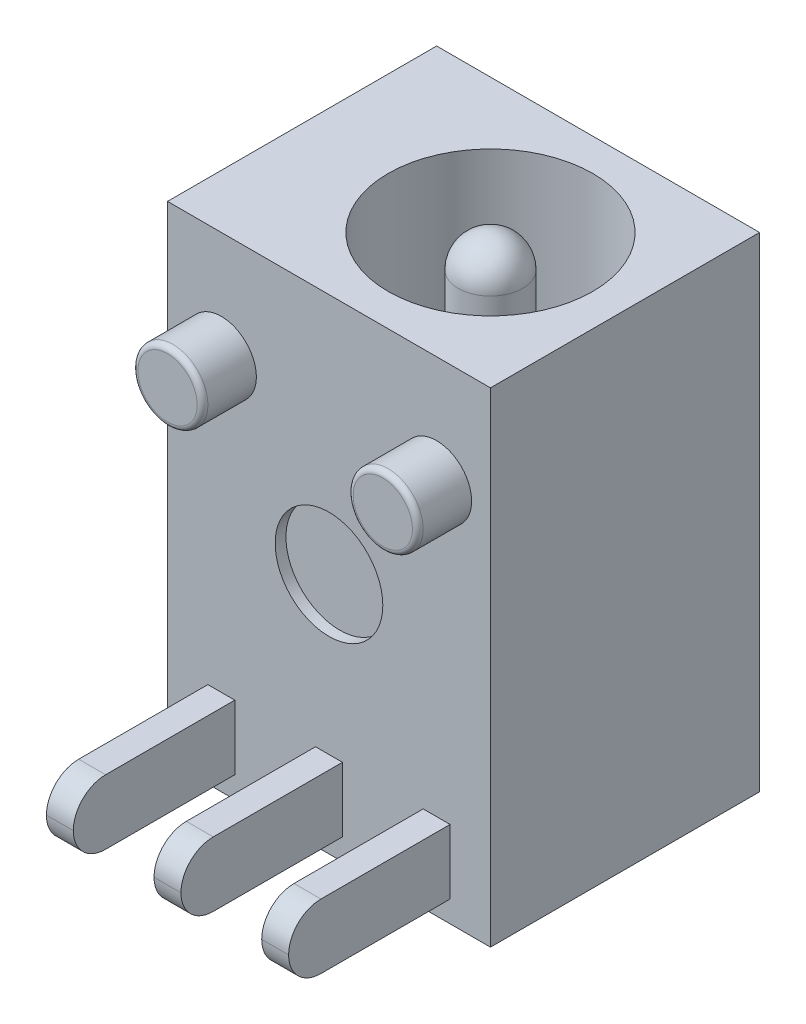
ISO-10303-21;
HEADER;
FILE_DESCRIPTION(('STEP AP214'),'2;1');
FILE_NAME('part.step','',(''),(''),'','','');
FILE_SCHEMA(('AUTOMOTIVE_DESIGN { 1 0 10303 214 1 1 1 1 }'));
ENDSEC;
DATA;
#1=APPLICATION_CONTEXT('core data for automotive mechanical design processes');
#2=APPLICATION_PROTOCOL_DEFINITION('international standard','automotive_design',2000,#1);
#3=PRODUCT_CONTEXT('',#1,'mechanical');
#4=PRODUCT('Part','Part','',(#3));
#5=PRODUCT_RELATED_PRODUCT_CATEGORY('part','',(#4));
#6=PRODUCT_DEFINITION_FORMATION('','',#4);
#7=PRODUCT_DEFINITION_CONTEXT('part definition',#1,'design');
#8=PRODUCT_DEFINITION('design','',#6,#7);
#9=PRODUCT_DEFINITION_SHAPE('','',#8);
#10=(LENGTH_UNIT() NAMED_UNIT(*) SI_UNIT(.MILLI.,.METRE.));
#11=(NAMED_UNIT(*) PLANE_ANGLE_UNIT() SI_UNIT($,.RADIAN.));
#12=(NAMED_UNIT(*) SI_UNIT($,.STERADIAN.) SOLID_ANGLE_UNIT());
#13=UNCERTAINTY_MEASURE_WITH_UNIT(LENGTH_MEASURE(1.E-05),#10,'distance_accuracy_value','');
#14=(GEOMETRIC_REPRESENTATION_CONTEXT(3) GLOBAL_UNCERTAINTY_ASSIGNED_CONTEXT((#13)) GLOBAL_UNIT_ASSIGNED_CONTEXT((#10,
#11,#12)) REPRESENTATION_CONTEXT('',''));
#15=CARTESIAN_POINT('',(0.,0.,0.));
#16=DIRECTION('',(0.,0.,1.));
#17=DIRECTION('',(1.,0.,0.));
#18=AXIS2_PLACEMENT_3D('',#15,#16,#17);
#19=CARTESIAN_POINT('',(-3.,9.,2.5));
#20=DIRECTION('',(0.,0.,-1.));
#21=DIRECTION('',(-1.,0.,0.));
#22=AXIS2_PLACEMENT_3D('',#19,#20,#21);
#23=PLANE('',#22);
#24=CARTESIAN_POINT('',(0.,4.5,2.5));
#25=DIRECTION('',(0.,0.,1.));
#26=DIRECTION('',(1.,0.,0.));
#27=AXIS2_PLACEMENT_3D('',#24,#25,#26);
#28=CIRCLE('',#27,1.);
#29=CARTESIAN_POINT('',(1.,4.5,2.5));
#30=VERTEX_POINT('',#29);
#31=EDGE_CURVE('E698',#30,#30,#28,.T.);
#32=ORIENTED_EDGE('',*,*,#31,.F.);
#33=EDGE_LOOP('',(#32));
#34=FACE_BOUND('',#33,.T.);
#35=CARTESIAN_POINT('',(-2.,7.,2.5));
#36=DIRECTION('',(0.,0.,-1.));
#37=DIRECTION('',(-1.,0.,0.));
#38=AXIS2_PLACEMENT_3D('',#35,#36,#37);
#39=CIRCLE('',#38,0.65);
#40=CARTESIAN_POINT('',(-2.65,7.,2.5));
#41=VERTEX_POINT('',#40);
#42=EDGE_CURVE('E327',#41,#41,#39,.F.);
#43=ORIENTED_EDGE('',*,*,#42,.F.);
#44=EDGE_LOOP('',(#43));
#45=FACE_BOUND('',#44,.T.);
#46=CARTESIAN_POINT('',(2.,7.,2.5));
#47=DIRECTION('',(0.,0.,-1.));
#48=DIRECTION('',(-1.,0.,0.));
#49=AXIS2_PLACEMENT_3D('',#46,#47,#48);
#50=CIRCLE('',#49,0.65);
#51=CARTESIAN_POINT('',(1.35,7.,2.5));
#52=VERTEX_POINT('',#51);
#53=EDGE_CURVE('E315',#52,#52,#50,.F.);
#54=ORIENTED_EDGE('',*,*,#53,.F.);
#55=EDGE_LOOP('',(#54));
#56=FACE_BOUND('',#55,.T.);
#57=DIRECTION('',(0.,-1.,0.));
#58=VECTOR('',#57,1.);
#59=CARTESIAN_POINT('',(-0.249999999999997,0.399999999999998,2.5));
#60=LINE('',#59,#58);
#61=CARTESIAN_POINT('',(-0.249999999999997,1.6,2.5));
#62=VERTEX_POINT('',#61);
#63=CARTESIAN_POINT('',(-0.249999999999997,0.399999999999999,2.5));
#64=VERTEX_POINT('',#63);
#65=EDGE_CURVE('E197',#62,#64,#60,.T.);
#66=ORIENTED_EDGE('',*,*,#65,.F.);
#67=DIRECTION('',(-1.,0.,0.));
#68=VECTOR('',#67,1.);
#69=CARTESIAN_POINT('',(0.250000000000003,1.6,2.5));
#70=LINE('',#69,#68);
#71=CARTESIAN_POINT('',(0.250000000000002,1.6,2.5));
#72=VERTEX_POINT('',#71);
#73=EDGE_CURVE('E206',#72,#62,#70,.T.);
#74=ORIENTED_EDGE('',*,*,#73,.F.);
#75=DIRECTION('',(0.,1.,0.));
#76=VECTOR('',#75,1.);
#77=CARTESIAN_POINT('',(0.250000000000003,0.399999999999998,2.5));
#78=LINE('',#77,#76);
#79=CARTESIAN_POINT('',(0.250000000000002,0.399999999999998,2.5));
#80=VERTEX_POINT('',#79);
#81=EDGE_CURVE('E203',#80,#72,#78,.T.);
#82=ORIENTED_EDGE('',*,*,#81,.F.);
#83=DIRECTION('',(1.,0.,0.));
#84=VECTOR('',#83,1.);
#85=CARTESIAN_POINT('',(0.250000000000003,0.399999999999998,2.5));
#86=LINE('',#85,#84);
#87=EDGE_CURVE('E200',#64,#80,#86,.T.);
#88=ORIENTED_EDGE('',*,*,#87,.F.);
#89=EDGE_LOOP('',(#66,#74,#82,#88));
#90=FACE_BOUND('',#89,.T.);
#91=DIRECTION('',(1.,0.,0.));
#92=VECTOR('',#91,1.);
#93=CARTESIAN_POINT('',(-3.,0.,2.5));
#94=LINE('',#93,#92);
#95=CARTESIAN_POINT('',(-3.,0.,2.5));
#96=VERTEX_POINT('',#95);
#97=CARTESIAN_POINT('',(3.,0.,2.5));
#98=VERTEX_POINT('',#97);
#99=EDGE_CURVE('E251',#96,#98,#94,.T.);
#100=ORIENTED_EDGE('',*,*,#99,.T.);
#101=DIRECTION('',(0.,-1.,0.));
#102=VECTOR('',#101,1.);
#103=CARTESIAN_POINT('',(3.,9.,2.5));
#104=LINE('',#103,#102);
#105=CARTESIAN_POINT('',(3.,9.,2.5));
#106=VERTEX_POINT('',#105);
#107=EDGE_CURVE('E257',#106,#98,#104,.T.);
#108=ORIENTED_EDGE('',*,*,#107,.F.);
#109=DIRECTION('',(1.,0.,0.));
#110=VECTOR('',#109,1.);
#111=CARTESIAN_POINT('',(-3.,9.,2.5));
#112=LINE('',#111,#110);
#113=CARTESIAN_POINT('',(-3.,9.,2.5));
#114=VERTEX_POINT('',#113);
#115=EDGE_CURVE('E255',#114,#106,#112,.T.);
#116=ORIENTED_EDGE('',*,*,#115,.F.);
#117=DIRECTION('',(0.,-1.,0.));
#118=VECTOR('',#117,1.);
#119=CARTESIAN_POINT('',(-3.,9.,2.5));
#120=LINE('',#119,#118);
#121=EDGE_CURVE('E267',#114,#96,#120,.T.);
#122=ORIENTED_EDGE('',*,*,#121,.T.);
#123=EDGE_LOOP('',(#100,#108,#116,#122));
#124=FACE_BOUND('',#123,.T.);
#125=DIRECTION('',(0.,-1.,0.));
#126=VECTOR('',#125,1.);
#127=CARTESIAN_POINT('',(1.75,1.6,2.5));
#128=LINE('',#127,#126);
#129=CARTESIAN_POINT('',(1.75,1.6,2.5));
#130=VERTEX_POINT('',#129);
#131=CARTESIAN_POINT('',(1.75,0.399999999999999,2.5));
#132=VERTEX_POINT('',#131);
#133=EDGE_CURVE('E217',#130,#132,#128,.T.);
#134=ORIENTED_EDGE('',*,*,#133,.F.);
#135=DIRECTION('',(-1.,0.,0.));
#136=VECTOR('',#135,1.);
#137=CARTESIAN_POINT('',(2.25,1.6,2.5));
#138=LINE('',#137,#136);
#139=CARTESIAN_POINT('',(2.25,1.6,2.5));
#140=VERTEX_POINT('',#139);
#141=EDGE_CURVE('E226',#140,#130,#138,.T.);
#142=ORIENTED_EDGE('',*,*,#141,.F.);
#143=DIRECTION('',(0.,1.,0.));
#144=VECTOR('',#143,1.);
#145=CARTESIAN_POINT('',(2.25,1.6,2.5));
#146=LINE('',#145,#144);
#147=CARTESIAN_POINT('',(2.25,0.399999999999999,2.5));
#148=VERTEX_POINT('',#147);
#149=EDGE_CURVE('E223',#148,#140,#146,.T.);
#150=ORIENTED_EDGE('',*,*,#149,.F.);
#151=DIRECTION('',(1.,0.,0.));
#152=VECTOR('',#151,1.);
#153=CARTESIAN_POINT('',(2.25,0.399999999999999,2.5));
#154=LINE('',#153,#152);
#155=EDGE_CURVE('E220',#132,#148,#154,.T.);
#156=ORIENTED_EDGE('',*,*,#155,.F.);
#157=EDGE_LOOP('',(#134,#142,#150,#156));
#158=FACE_BOUND('',#157,.T.);
#159=DIRECTION('',(0.,-1.,0.));
#160=VECTOR('',#159,1.);
#161=CARTESIAN_POINT('',(-2.25,0.399999999999998,2.5));
#162=LINE('',#161,#160);
#163=CARTESIAN_POINT('',(-2.25,1.6,2.5));
#164=VERTEX_POINT('',#163);
#165=CARTESIAN_POINT('',(-2.25,0.399999999999998,2.5));
#166=VERTEX_POINT('',#165);
#167=EDGE_CURVE('E167',#164,#166,#162,.T.);
#168=ORIENTED_EDGE('',*,*,#167,.F.);
#169=DIRECTION('',(-1.,0.,0.));
#170=VECTOR('',#169,1.);
#171=CARTESIAN_POINT('',(-1.75,1.6,2.5));
#172=LINE('',#171,#170);
#173=CARTESIAN_POINT('',(-1.75,1.6,2.5));
#174=VERTEX_POINT('',#173);
#175=EDGE_CURVE('E174',#174,#164,#172,.T.);
#176=ORIENTED_EDGE('',*,*,#175,.F.);
#177=DIRECTION('',(0.,1.,0.));
#178=VECTOR('',#177,1.);
#179=CARTESIAN_POINT('',(-1.75,0.399999999999998,2.5));
#180=LINE('',#179,#178);
#181=CARTESIAN_POINT('',(-1.75,0.399999999999998,2.5));
#182=VERTEX_POINT('',#181);
#183=EDGE_CURVE('E187',#182,#174,#180,.T.);
#184=ORIENTED_EDGE('',*,*,#183,.F.);
#185=DIRECTION('',(1.,0.,0.));
#186=VECTOR('',#185,1.);
#187=CARTESIAN_POINT('',(-1.75,0.399999999999998,2.5));
#188=LINE('',#187,#186);
#189=EDGE_CURVE('E182',#166,#182,#188,.T.);
#190=ORIENTED_EDGE('',*,*,#189,.F.);
#191=EDGE_LOOP('',(#168,#176,#184,#190));
#192=FACE_BOUND('',#191,.T.);
#193=ADVANCED_FACE('F34',(#34,#45,#56,#90,#124,#158,#192),#23,.F.);
#194=CARTESIAN_POINT('',(3.,9.,2.5));
#195=DIRECTION('',(-1.,0.,0.));
#196=DIRECTION('',(0.,0.,1.));
#197=AXIS2_PLACEMENT_3D('',#194,#195,#196);
#198=PLANE('',#197);
#199=DIRECTION('',(0.,0.,-1.));
#200=VECTOR('',#199,1.);
#201=CARTESIAN_POINT('',(3.,0.,2.5));
#202=LINE('',#201,#200);
#203=CARTESIAN_POINT('',(3.,0.,-2.5));
#204=VERTEX_POINT('',#203);
#205=EDGE_CURVE('E244',#98,#204,#202,.T.);
#206=ORIENTED_EDGE('',*,*,#205,.T.);
#207=DIRECTION('',(0.,-1.,0.));
#208=VECTOR('',#207,1.);
#209=CARTESIAN_POINT('',(3.,9.,-2.5));
#210=LINE('',#209,#208);
#211=CARTESIAN_POINT('',(3.,9.,-2.5));
#212=VERTEX_POINT('',#211);
#213=EDGE_CURVE('E273',#212,#204,#210,.T.);
#214=ORIENTED_EDGE('',*,*,#213,.F.);
#215=DIRECTION('',(0.,0.,-1.));
#216=VECTOR('',#215,1.);
#217=CARTESIAN_POINT('',(3.,9.,2.5));
#218=LINE('',#217,#216);
#219=EDGE_CURVE('E247',#106,#212,#218,.T.);
#220=ORIENTED_EDGE('',*,*,#219,.F.);
#221=ORIENTED_EDGE('',*,*,#107,.T.);
#222=EDGE_LOOP('',(#206,#214,#220,#221));
#223=FACE_BOUND('',#222,.T.);
#224=ADVANCED_FACE('F355',(#223),#198,.F.);
#225=CARTESIAN_POINT('',(-3.,9.,-2.5));
#226=DIRECTION('',(0.,0.,1.));
#227=DIRECTION('',(1.,0.,0.));
#228=AXIS2_PLACEMENT_3D('',#225,#226,#227);
#229=PLANE('',#228);
#230=DIRECTION('',(-1.,0.,0.));
#231=VECTOR('',#230,1.);
#232=CARTESIAN_POINT('',(-3.,0.,-2.5));
#233=LINE('',#232,#231);
#234=CARTESIAN_POINT('',(-3.,0.,-2.5));
#235=VERTEX_POINT('',#234);
#236=EDGE_CURVE('E260',#204,#235,#233,.T.);
#237=ORIENTED_EDGE('',*,*,#236,.T.);
#238=DIRECTION('',(0.,-1.,0.));
#239=VECTOR('',#238,1.);
#240=CARTESIAN_POINT('',(-3.,9.,-2.5));
#241=LINE('',#240,#239);
#242=CARTESIAN_POINT('',(-3.,9.,-2.5));
#243=VERTEX_POINT('',#242);
#244=EDGE_CURVE('E270',#243,#235,#241,.T.);
#245=ORIENTED_EDGE('',*,*,#244,.F.);
#246=DIRECTION('',(-1.,0.,0.));
#247=VECTOR('',#246,1.);
#248=CARTESIAN_POINT('',(-3.,9.,-2.5));
#249=LINE('',#248,#247);
#250=EDGE_CURVE('E250',#212,#243,#249,.T.);
#251=ORIENTED_EDGE('',*,*,#250,.F.);
#252=ORIENTED_EDGE('',*,*,#213,.T.);
#253=EDGE_LOOP('',(#237,#245,#251,#252));
#254=FACE_BOUND('',#253,.T.);
#255=ADVANCED_FACE('F361',(#254),#229,.F.);
#256=CARTESIAN_POINT('',(-3.,9.,2.5));
#257=DIRECTION('',(1.,0.,0.));
#258=DIRECTION('',(0.,0.,-1.));
#259=AXIS2_PLACEMENT_3D('',#256,#257,#258);
#260=PLANE('',#259);
#261=DIRECTION('',(0.,0.,1.));
#262=VECTOR('',#261,1.);
#263=CARTESIAN_POINT('',(-3.,0.,2.5));
#264=LINE('',#263,#262);
#265=EDGE_CURVE('E262',#235,#96,#264,.T.);
#266=ORIENTED_EDGE('',*,*,#265,.T.);
#267=ORIENTED_EDGE('',*,*,#121,.F.);
#268=DIRECTION('',(0.,0.,1.));
#269=VECTOR('',#268,1.);
#270=CARTESIAN_POINT('',(-3.,9.,2.5));
#271=LINE('',#270,#269);
#272=EDGE_CURVE('E253',#243,#114,#271,.T.);
#273=ORIENTED_EDGE('',*,*,#272,.F.);
#274=ORIENTED_EDGE('',*,*,#244,.T.);
#275=EDGE_LOOP('',(#266,#267,#273,#274));
#276=FACE_BOUND('',#275,.T.);
#277=ADVANCED_FACE('F370',(#276),#260,.F.);
#278=CARTESIAN_POINT('',(0.,9.,0.));
#279=DIRECTION('',(0.,-1.,0.));
#280=DIRECTION('',(0.,0.,-1.));
#281=AXIS2_PLACEMENT_3D('',#278,#279,#280);
#282=PLANE('',#281);
#283=CARTESIAN_POINT('',(0.500000000000001,9.,0.));
#284=DIRECTION('',(0.,1.,0.));
#285=DIRECTION('',(0.,0.,1.));
#286=AXIS2_PLACEMENT_3D('',#283,#284,#285);
#287=CIRCLE('',#286,1.9);
#288=CARTESIAN_POINT('',(0.500000000000001,9.,1.9));
#289=VERTEX_POINT('',#288);
#290=EDGE_CURVE('E240',#289,#289,#287,.T.);
#291=ORIENTED_EDGE('',*,*,#290,.F.);
#292=EDGE_LOOP('',(#291));
#293=FACE_BOUND('',#292,.T.);
#294=ORIENTED_EDGE('',*,*,#219,.T.);
#295=ORIENTED_EDGE('',*,*,#250,.T.);
#296=ORIENTED_EDGE('',*,*,#272,.T.);
#297=ORIENTED_EDGE('',*,*,#115,.T.);
#298=EDGE_LOOP('',(#294,#295,#296,#297));
#299=FACE_BOUND('',#298,.T.);
#300=ADVANCED_FACE('F373',(#293,#299),#282,.F.);
#301=CARTESIAN_POINT('',(0.,0.,0.));
#302=DIRECTION('',(0.,-1.,0.));
#303=DIRECTION('',(0.,0.,-1.));
#304=AXIS2_PLACEMENT_3D('',#301,#302,#303);
#305=PLANE('',#304);
#306=ORIENTED_EDGE('',*,*,#205,.F.);
#307=ORIENTED_EDGE('',*,*,#99,.F.);
#308=ORIENTED_EDGE('',*,*,#265,.F.);
#309=ORIENTED_EDGE('',*,*,#236,.F.);
#310=EDGE_LOOP('',(#306,#307,#308,#309));
#311=FACE_BOUND('',#310,.T.);
#312=ADVANCED_FACE('F368',(#311),#305,.T.);
#313=CARTESIAN_POINT('',(0.500000000000001,2.,0.));
#314=DIRECTION('',(0.,1.,0.));
#315=DIRECTION('',(0.,0.,1.));
#316=AXIS2_PLACEMENT_3D('',#313,#314,#315);
#317=CYLINDRICAL_SURFACE('',#316,1.9);
#318=CARTESIAN_POINT('',(0.500000000000001,2.,0.));
#319=DIRECTION('',(0.,1.,0.));
#320=DIRECTION('',(0.,0.,1.));
#321=AXIS2_PLACEMENT_3D('',#318,#319,#320);
#322=CIRCLE('',#321,1.9);
#323=CARTESIAN_POINT('',(0.500000000000001,2.,1.9));
#324=VERTEX_POINT('',#323);
#325=EDGE_CURVE('E241',#324,#324,#322,.T.);
#326=ORIENTED_EDGE('',*,*,#325,.F.);
#327=EDGE_LOOP('',(#326));
#328=FACE_BOUND('',#327,.T.);
#329=ORIENTED_EDGE('',*,*,#290,.T.);
#330=EDGE_LOOP('',(#329));
#331=FACE_BOUND('',#330,.T.);
#332=ADVANCED_FACE('F441',(#328,#331),#317,.F.);
#333=CARTESIAN_POINT('',(0.500000000000001,2.,0.));
#334=DIRECTION('',(0.,1.,0.));
#335=DIRECTION('',(0.,0.,1.));
#336=AXIS2_PLACEMENT_3D('',#333,#334,#335);
#337=PLANE('',#336);
#338=CARTESIAN_POINT('',(0.500000000000001,2.,0.));
#339=DIRECTION('',(0.,1.,0.));
#340=DIRECTION('',(0.,0.,1.));
#341=AXIS2_PLACEMENT_3D('',#338,#339,#340);
#342=CIRCLE('',#341,0.6);
#343=CARTESIAN_POINT('',(0.500000000000001,2.,0.6));
#344=VERTEX_POINT('',#343);
#345=EDGE_CURVE('E237',#344,#344,#342,.T.);
#346=ORIENTED_EDGE('',*,*,#345,.F.);
#347=EDGE_LOOP('',(#346));
#348=FACE_BOUND('',#347,.T.);
#349=ORIENTED_EDGE('',*,*,#325,.T.);
#350=EDGE_LOOP('',(#349));
#351=FACE_BOUND('',#350,.T.);
#352=ADVANCED_FACE('F437',(#348,#351),#337,.T.);
#353=CARTESIAN_POINT('',(0.500000000000001,2.,0.));
#354=DIRECTION('',(0.,1.,0.));
#355=DIRECTION('',(0.,0.,1.));
#356=AXIS2_PLACEMENT_3D('',#353,#354,#355);
#357=CYLINDRICAL_SURFACE('',#356,0.6);
#358=CARTESIAN_POINT('',(0.500000000000001,8.4,0.));
#359=DIRECTION('',(0.,1.,0.));
#360=DIRECTION('',(0.,0.,1.));
#361=AXIS2_PLACEMENT_3D('',#358,#359,#360);
#362=CIRCLE('',#361,0.6);
#363=CARTESIAN_POINT('',(0.500000000000001,8.4,0.6));
#364=VERTEX_POINT('',#363);
#365=EDGE_CURVE('E276',#364,#364,#362,.F.);
#366=ORIENTED_EDGE('',*,*,#365,.T.);
#367=EDGE_LOOP('',(#366));
#368=FACE_BOUND('',#367,.T.);
#369=ORIENTED_EDGE('',*,*,#345,.T.);
#370=EDGE_LOOP('',(#369));
#371=FACE_BOUND('',#370,.T.);
#372=ADVANCED_FACE('F382',(#368,#371),#357,.T.);
#373=CARTESIAN_POINT('',(0.500000000000001,8.4,0.));
#374=DIRECTION('',(0.,-1.,0.));
#375=DIRECTION('',(0.,0.,-1.));
#376=AXIS2_PLACEMENT_3D('',#373,#374,#375);
#377=SPHERICAL_SURFACE('',#376,0.6);
#378=ORIENTED_EDGE('',*,*,#365,.F.);
#379=EDGE_LOOP('',(#378));
#380=FACE_BOUND('',#379,.T.);
#381=ADVANCED_FACE('F378',(#380),#377,.T.);
#382=CARTESIAN_POINT('',(1.75,1.6,5.5));
#383=DIRECTION('',(1.,0.,0.));
#384=DIRECTION('',(0.,0.,-1.));
#385=AXIS2_PLACEMENT_3D('',#382,#383,#384);
#386=PLANE('',#385);
#387=DIRECTION('',(0.,0.,-1.));
#388=VECTOR('',#387,1.);
#389=CARTESIAN_POINT('',(1.75,0.399999999999999,5.5));
#390=LINE('',#389,#388);
#391=CARTESIAN_POINT('',(1.75,0.399999999999999,4.9));
#392=VERTEX_POINT('',#391);
#393=EDGE_CURVE('E235',#392,#132,#390,.T.);
#394=ORIENTED_EDGE('',*,*,#393,.F.);
#395=CARTESIAN_POINT('',(1.75,0.999999999999999,4.9));
#396=DIRECTION('',(1.,0.,0.));
#397=DIRECTION('',(0.,0.,-1.));
#398=AXIS2_PLACEMENT_3D('',#395,#396,#397);
#399=CIRCLE('',#398,0.6);
#400=CARTESIAN_POINT('',(1.75,1.,5.5));
#401=VERTEX_POINT('',#400);
#402=EDGE_CURVE('E54',#392,#401,#399,.F.);
#403=ORIENTED_EDGE('',*,*,#402,.T.);
#404=CARTESIAN_POINT('',(1.75,1.,4.9));
#405=DIRECTION('',(1.,0.,0.));
#406=DIRECTION('',(0.,0.,-1.));
#407=AXIS2_PLACEMENT_3D('',#404,#405,#406);
#408=CIRCLE('',#407,0.6);
#409=CARTESIAN_POINT('',(1.75,1.6,4.9));
#410=VERTEX_POINT('',#409);
#411=EDGE_CURVE('E49',#401,#410,#408,.F.);
#412=ORIENTED_EDGE('',*,*,#411,.T.);
#413=DIRECTION('',(0.,0.,-1.));
#414=VECTOR('',#413,1.);
#415=CARTESIAN_POINT('',(1.75,1.6,5.5));
#416=LINE('',#415,#414);
#417=EDGE_CURVE('E229',#410,#130,#416,.T.);
#418=ORIENTED_EDGE('',*,*,#417,.T.);
#419=ORIENTED_EDGE('',*,*,#133,.T.);
#420=EDGE_LOOP('',(#394,#403,#412,#418,#419));
#421=FACE_BOUND('',#420,.T.);
#422=ADVANCED_FACE('F381',(#421),#386,.F.);
#423=CARTESIAN_POINT('',(2.25,0.399999999999999,5.5));
#424=DIRECTION('',(0.,1.,0.));
#425=DIRECTION('',(0.,0.,1.));
#426=AXIS2_PLACEMENT_3D('',#423,#424,#425);
#427=PLANE('',#426);
#428=DIRECTION('',(0.,0.,-1.));
#429=VECTOR('',#428,1.);
#430=CARTESIAN_POINT('',(2.25,0.399999999999999,5.5));
#431=LINE('',#430,#429);
#432=CARTESIAN_POINT('',(2.25,0.399999999999999,4.9));
#433=VERTEX_POINT('',#432);
#434=EDGE_CURVE('E233',#433,#148,#431,.T.);
#435=ORIENTED_EDGE('',*,*,#434,.F.);
#436=DIRECTION('',(1.,0.,0.));
#437=VECTOR('',#436,1.);
#438=CARTESIAN_POINT('',(2.25,0.399999999999999,4.9));
#439=LINE('',#438,#437);
#440=EDGE_CURVE('E308',#433,#392,#439,.F.);
#441=ORIENTED_EDGE('',*,*,#440,.T.);
#442=ORIENTED_EDGE('',*,*,#393,.T.);
#443=ORIENTED_EDGE('',*,*,#155,.T.);
#444=EDGE_LOOP('',(#435,#441,#442,#443));
#445=FACE_BOUND('',#444,.T.);
#446=ADVANCED_FACE('F425',(#445),#427,.F.);
#447=CARTESIAN_POINT('',(2.25,1.6,5.5));
#448=DIRECTION('',(-1.,0.,0.));
#449=DIRECTION('',(0.,-1.,0.));
#450=AXIS2_PLACEMENT_3D('',#447,#448,#449);
#451=PLANE('',#450);
#452=CARTESIAN_POINT('',(2.25,1.,4.9));
#453=DIRECTION('',(-1.,0.,0.));
#454=DIRECTION('',(0.,-1.,0.));
#455=AXIS2_PLACEMENT_3D('',#452,#453,#454);
#456=CIRCLE('',#455,0.6);
#457=CARTESIAN_POINT('',(2.25,1.6,4.9));
#458=VERTEX_POINT('',#457);
#459=CARTESIAN_POINT('',(2.25,1.,5.5));
#460=VERTEX_POINT('',#459);
#461=EDGE_CURVE('E304',#458,#460,#456,.F.);
#462=ORIENTED_EDGE('',*,*,#461,.T.);
#463=CARTESIAN_POINT('',(2.25,0.999999999999999,4.9));
#464=DIRECTION('',(-1.,0.,0.));
#465=DIRECTION('',(0.,-1.,0.));
#466=AXIS2_PLACEMENT_3D('',#463,#464,#465);
#467=CIRCLE('',#466,0.6);
#468=EDGE_CURVE('E306',#460,#433,#467,.F.);
#469=ORIENTED_EDGE('',*,*,#468,.T.);
#470=ORIENTED_EDGE('',*,*,#434,.T.);
#471=ORIENTED_EDGE('',*,*,#149,.T.);
#472=DIRECTION('',(0.,0.,-1.));
#473=VECTOR('',#472,1.);
#474=CARTESIAN_POINT('',(2.25,1.6,5.5));
#475=LINE('',#474,#473);
#476=EDGE_CURVE('E231',#458,#140,#475,.T.);
#477=ORIENTED_EDGE('',*,*,#476,.F.);
#478=EDGE_LOOP('',(#462,#469,#470,#471,#477));
#479=FACE_BOUND('',#478,.T.);
#480=ADVANCED_FACE('F418',(#479),#451,.F.);
#481=CARTESIAN_POINT('',(2.25,1.6,5.5));
#482=DIRECTION('',(0.,-1.,0.));
#483=DIRECTION('',(0.,0.,-1.));
#484=AXIS2_PLACEMENT_3D('',#481,#482,#483);
#485=PLANE('',#484);
#486=ORIENTED_EDGE('',*,*,#417,.F.);
#487=DIRECTION('',(-1.,0.,0.));
#488=VECTOR('',#487,1.);
#489=CARTESIAN_POINT('',(2.25,1.6,4.9));
#490=LINE('',#489,#488);
#491=EDGE_CURVE('E313',#410,#458,#490,.F.);
#492=ORIENTED_EDGE('',*,*,#491,.T.);
#493=ORIENTED_EDGE('',*,*,#476,.T.);
#494=ORIENTED_EDGE('',*,*,#141,.T.);
#495=EDGE_LOOP('',(#486,#492,#493,#494));
#496=FACE_BOUND('',#495,.T.);
#497=ADVANCED_FACE('F415',(#496),#485,.F.);
#498=CARTESIAN_POINT('',(-0.249999999999997,0.399999999999998,5.5));
#499=DIRECTION('',(1.,0.,0.));
#500=DIRECTION('',(0.,0.,-1.));
#501=AXIS2_PLACEMENT_3D('',#498,#499,#500);
#502=PLANE('',#501);
#503=CARTESIAN_POINT('',(-0.249999999999997,0.999999999999998,4.9));
#504=DIRECTION('',(1.,0.,0.));
#505=DIRECTION('',(0.,0.,-1.));
#506=AXIS2_PLACEMENT_3D('',#503,#504,#505);
#507=CIRCLE('',#506,0.6);
#508=CARTESIAN_POINT('',(-0.249999999999997,0.399999999999998,4.9));
#509=VERTEX_POINT('',#508);
#510=CARTESIAN_POINT('',(-0.249999999999997,0.999999999999998,5.5));
#511=VERTEX_POINT('',#510);
#512=EDGE_CURVE('E291',#509,#511,#507,.F.);
#513=ORIENTED_EDGE('',*,*,#512,.T.);
#514=CARTESIAN_POINT('',(-0.249999999999997,0.999999999999999,4.9));
#515=DIRECTION('',(1.,0.,0.));
#516=DIRECTION('',(0.,0.,-1.));
#517=AXIS2_PLACEMENT_3D('',#514,#515,#516);
#518=CIRCLE('',#517,0.6);
#519=CARTESIAN_POINT('',(-0.249999999999997,1.6,4.9));
#520=VERTEX_POINT('',#519);
#521=EDGE_CURVE('E293',#511,#520,#518,.F.);
#522=ORIENTED_EDGE('',*,*,#521,.T.);
#523=DIRECTION('',(0.,0.,-1.));
#524=VECTOR('',#523,1.);
#525=CARTESIAN_POINT('',(-0.249999999999997,1.6,5.5));
#526=LINE('',#525,#524);
#527=EDGE_CURVE('E209',#520,#62,#526,.T.);
#528=ORIENTED_EDGE('',*,*,#527,.T.);
#529=ORIENTED_EDGE('',*,*,#65,.T.);
#530=DIRECTION('',(0.,0.,-1.));
#531=VECTOR('',#530,1.);
#532=CARTESIAN_POINT('',(-0.249999999999997,0.399999999999998,5.5));
#533=LINE('',#532,#531);
#534=EDGE_CURVE('E215',#509,#64,#533,.T.);
#535=ORIENTED_EDGE('',*,*,#534,.F.);
#536=EDGE_LOOP('',(#513,#522,#528,#529,#535));
#537=FACE_BOUND('',#536,.T.);
#538=ADVANCED_FACE('F511',(#537),#502,.F.);
#539=CARTESIAN_POINT('',(0.250000000000003,0.399999999999998,5.5));
#540=DIRECTION('',(0.,1.,0.));
#541=DIRECTION('',(0.,0.,1.));
#542=AXIS2_PLACEMENT_3D('',#539,#540,#541);
#543=PLANE('',#542);
#544=DIRECTION('',(0.,0.,-1.));
#545=VECTOR('',#544,1.);
#546=CARTESIAN_POINT('',(0.250000000000003,0.399999999999998,5.5));
#547=LINE('',#546,#545);
#548=CARTESIAN_POINT('',(0.250000000000003,0.399999999999998,4.9));
#549=VERTEX_POINT('',#548);
#550=EDGE_CURVE('E213',#549,#80,#547,.T.);
#551=ORIENTED_EDGE('',*,*,#550,.F.);
#552=DIRECTION('',(1.,0.,0.));
#553=VECTOR('',#552,1.);
#554=CARTESIAN_POINT('',(-0.249999999999997,0.399999999999998,4.9));
#555=LINE('',#554,#553);
#556=EDGE_CURVE('E302',#549,#509,#555,.F.);
#557=ORIENTED_EDGE('',*,*,#556,.T.);
#558=ORIENTED_EDGE('',*,*,#534,.T.);
#559=ORIENTED_EDGE('',*,*,#87,.T.);
#560=EDGE_LOOP('',(#551,#557,#558,#559));
#561=FACE_BOUND('',#560,.T.);
#562=ADVANCED_FACE('F520',(#561),#543,.F.);
#563=CARTESIAN_POINT('',(0.250000000000003,0.399999999999998,5.5));
#564=DIRECTION('',(-1.,0.,0.));
#565=DIRECTION('',(0.,0.,1.));
#566=AXIS2_PLACEMENT_3D('',#563,#564,#565);
#567=PLANE('',#566);
#568=DIRECTION('',(0.,0.,-1.));
#569=VECTOR('',#568,1.);
#570=CARTESIAN_POINT('',(0.250000000000003,1.6,5.5));
#571=LINE('',#570,#569);
#572=CARTESIAN_POINT('',(0.250000000000003,1.6,4.9));
#573=VERTEX_POINT('',#572);
#574=EDGE_CURVE('E211',#573,#72,#571,.T.);
#575=ORIENTED_EDGE('',*,*,#574,.F.);
#576=CARTESIAN_POINT('',(0.250000000000003,0.999999999999999,4.9));
#577=DIRECTION('',(-1.,0.,0.));
#578=DIRECTION('',(0.,0.,1.));
#579=AXIS2_PLACEMENT_3D('',#576,#577,#578);
#580=CIRCLE('',#579,0.6);
#581=CARTESIAN_POINT('',(0.250000000000003,0.999999999999998,5.5));
#582=VERTEX_POINT('',#581);
#583=EDGE_CURVE('E300',#573,#582,#580,.F.);
#584=ORIENTED_EDGE('',*,*,#583,.T.);
#585=CARTESIAN_POINT('',(0.250000000000003,0.999999999999998,4.9));
#586=DIRECTION('',(-1.,0.,0.));
#587=DIRECTION('',(0.,0.,1.));
#588=AXIS2_PLACEMENT_3D('',#585,#586,#587);
#589=CIRCLE('',#588,0.6);
#590=EDGE_CURVE('E298',#582,#549,#589,.F.);
#591=ORIENTED_EDGE('',*,*,#590,.T.);
#592=ORIENTED_EDGE('',*,*,#550,.T.);
#593=ORIENTED_EDGE('',*,*,#81,.T.);
#594=EDGE_LOOP('',(#575,#584,#591,#592,#593));
#595=FACE_BOUND('',#594,.T.);
#596=ADVANCED_FACE('F530',(#595),#567,.F.);
#597=CARTESIAN_POINT('',(0.250000000000003,1.6,5.5));
#598=DIRECTION('',(0.,-1.,0.));
#599=DIRECTION('',(0.,0.,-1.));
#600=AXIS2_PLACEMENT_3D('',#597,#598,#599);
#601=PLANE('',#600);
#602=ORIENTED_EDGE('',*,*,#527,.F.);
#603=DIRECTION('',(-1.,0.,0.));
#604=VECTOR('',#603,1.);
#605=CARTESIAN_POINT('',(0.250000000000003,1.6,4.9));
#606=LINE('',#605,#604);
#607=EDGE_CURVE('E295',#520,#573,#606,.F.);
#608=ORIENTED_EDGE('',*,*,#607,.T.);
#609=ORIENTED_EDGE('',*,*,#574,.T.);
#610=ORIENTED_EDGE('',*,*,#73,.T.);
#611=EDGE_LOOP('',(#602,#608,#609,#610));
#612=FACE_BOUND('',#611,.T.);
#613=ADVANCED_FACE('F540',(#612),#601,.F.);
#614=CARTESIAN_POINT('',(-2.25,0.399999999999998,5.5));
#615=DIRECTION('',(1.,0.,0.));
#616=DIRECTION('',(0.,0.,-1.));
#617=AXIS2_PLACEMENT_3D('',#614,#615,#616);
#618=PLANE('',#617);
#619=DIRECTION('',(0.,0.,-1.));
#620=VECTOR('',#619,1.);
#621=CARTESIAN_POINT('',(-2.25,0.399999999999998,5.5));
#622=LINE('',#621,#620);
#623=CARTESIAN_POINT('',(-2.25,0.399999999999998,4.9));
#624=VERTEX_POINT('',#623);
#625=EDGE_CURVE('E195',#624,#166,#622,.T.);
#626=ORIENTED_EDGE('',*,*,#625,.F.);
#627=CARTESIAN_POINT('',(-2.25,0.999999999999998,4.9));
#628=DIRECTION('',(1.,0.,0.));
#629=DIRECTION('',(0.,0.,-1.));
#630=AXIS2_PLACEMENT_3D('',#627,#628,#629);
#631=CIRCLE('',#630,0.6);
#632=CARTESIAN_POINT('',(-2.25,0.999999999999998,5.5));
#633=VERTEX_POINT('',#632);
#634=EDGE_CURVE('E287',#624,#633,#631,.F.);
#635=ORIENTED_EDGE('',*,*,#634,.T.);
#636=CARTESIAN_POINT('',(-2.25,0.999999999999998,4.9));
#637=DIRECTION('',(1.,0.,0.));
#638=DIRECTION('',(0.,0.,-1.));
#639=AXIS2_PLACEMENT_3D('',#636,#637,#638);
#640=CIRCLE('',#639,0.6);
#641=CARTESIAN_POINT('',(-2.25,1.6,4.9));
#642=VERTEX_POINT('',#641);
#643=EDGE_CURVE('E169',#633,#642,#640,.F.);
#644=ORIENTED_EDGE('',*,*,#643,.T.);
#645=DIRECTION('',(0.,0.,-1.));
#646=VECTOR('',#645,1.);
#647=CARTESIAN_POINT('',(-2.25,1.6,5.5));
#648=LINE('',#647,#646);
#649=EDGE_CURVE('E163',#642,#164,#648,.T.);
#650=ORIENTED_EDGE('',*,*,#649,.T.);
#651=ORIENTED_EDGE('',*,*,#167,.T.);
#652=EDGE_LOOP('',(#626,#635,#644,#650,#651));
#653=FACE_BOUND('',#652,.T.);
#654=ADVANCED_FACE('F166',(#653),#618,.F.);
#655=CARTESIAN_POINT('',(-1.75,0.399999999999998,5.5));
#656=DIRECTION('',(0.,1.,0.));
#657=DIRECTION('',(0.,0.,1.));
#658=AXIS2_PLACEMENT_3D('',#655,#656,#657);
#659=PLANE('',#658);
#660=DIRECTION('',(0.,0.,-1.));
#661=VECTOR('',#660,1.);
#662=CARTESIAN_POINT('',(-1.75,0.399999999999998,5.5));
#663=LINE('',#662,#661);
#664=CARTESIAN_POINT('',(-1.75,0.399999999999998,4.9));
#665=VERTEX_POINT('',#664);
#666=EDGE_CURVE('E193',#665,#182,#663,.T.);
#667=ORIENTED_EDGE('',*,*,#666,.F.);
#668=DIRECTION('',(1.,0.,0.));
#669=VECTOR('',#668,1.);
#670=CARTESIAN_POINT('',(-2.25,0.399999999999998,4.9));
#671=LINE('',#670,#669);
#672=EDGE_CURVE('E283',#665,#624,#671,.F.);
#673=ORIENTED_EDGE('',*,*,#672,.T.);
#674=ORIENTED_EDGE('',*,*,#625,.T.);
#675=ORIENTED_EDGE('',*,*,#189,.T.);
#676=EDGE_LOOP('',(#667,#673,#674,#675));
#677=FACE_BOUND('',#676,.T.);
#678=ADVANCED_FACE('F559',(#677),#659,.F.);
#679=CARTESIAN_POINT('',(-1.75,0.399999999999998,5.5));
#680=DIRECTION('',(-1.,0.,0.));
#681=DIRECTION('',(0.,0.,1.));
#682=AXIS2_PLACEMENT_3D('',#679,#680,#681);
#683=PLANE('',#682);
#684=CARTESIAN_POINT('',(-1.75,0.999999999999998,4.9));
#685=DIRECTION('',(-1.,0.,0.));
#686=DIRECTION('',(0.,0.,1.));
#687=AXIS2_PLACEMENT_3D('',#684,#685,#686);
#688=CIRCLE('',#687,0.6);
#689=CARTESIAN_POINT('',(-1.75,1.6,4.9));
#690=VERTEX_POINT('',#689);
#691=CARTESIAN_POINT('',(-1.75,0.999999999999998,5.5));
#692=VERTEX_POINT('',#691);
#693=EDGE_CURVE('E279',#690,#692,#688,.F.);
#694=ORIENTED_EDGE('',*,*,#693,.T.);
#695=CARTESIAN_POINT('',(-1.75,0.999999999999998,4.9));
#696=DIRECTION('',(-1.,0.,0.));
#697=DIRECTION('',(0.,0.,1.));
#698=AXIS2_PLACEMENT_3D('',#695,#696,#697);
#699=CIRCLE('',#698,0.6);
#700=EDGE_CURVE('E281',#692,#665,#699,.F.);
#701=ORIENTED_EDGE('',*,*,#700,.T.);
#702=ORIENTED_EDGE('',*,*,#666,.T.);
#703=ORIENTED_EDGE('',*,*,#183,.T.);
#704=DIRECTION('',(0.,0.,-1.));
#705=VECTOR('',#704,1.);
#706=CARTESIAN_POINT('',(-1.75,1.6,5.5));
#707=LINE('',#706,#705);
#708=EDGE_CURVE('E173',#690,#174,#707,.T.);
#709=ORIENTED_EDGE('',*,*,#708,.F.);
#710=EDGE_LOOP('',(#694,#701,#702,#703,#709));
#711=FACE_BOUND('',#710,.T.);
#712=ADVANCED_FACE('F568',(#711),#683,.F.);
#713=CARTESIAN_POINT('',(-1.75,1.6,5.5));
#714=DIRECTION('',(0.,-1.,0.));
#715=DIRECTION('',(0.,0.,-1.));
#716=AXIS2_PLACEMENT_3D('',#713,#714,#715);
#717=PLANE('',#716);
#718=ORIENTED_EDGE('',*,*,#649,.F.);
#719=DIRECTION('',(-1.,0.,0.));
#720=VECTOR('',#719,1.);
#721=CARTESIAN_POINT('',(-1.75,1.6,4.9));
#722=LINE('',#721,#720);
#723=EDGE_CURVE('E289',#642,#690,#722,.F.);
#724=ORIENTED_EDGE('',*,*,#723,.T.);
#725=ORIENTED_EDGE('',*,*,#708,.T.);
#726=ORIENTED_EDGE('',*,*,#175,.T.);
#727=EDGE_LOOP('',(#718,#724,#725,#726));
#728=FACE_BOUND('',#727,.T.);
#729=ADVANCED_FACE('F185',(#728),#717,.F.);
#730=CARTESIAN_POINT('',(0.,0.999999999999998,4.9));
#731=DIRECTION('',(1.,0.,0.));
#732=DIRECTION('',(0.,0.,-1.));
#733=AXIS2_PLACEMENT_3D('',#730,#731,#732);
#734=CYLINDRICAL_SURFACE('',#733,0.6);
#735=ORIENTED_EDGE('',*,*,#723,.F.);
#736=ORIENTED_EDGE('',*,*,#643,.F.);
#737=DIRECTION('',(-1.,0.,0.));
#738=VECTOR('',#737,1.);
#739=CARTESIAN_POINT('',(-2.25,0.999999999999998,5.5));
#740=LINE('',#739,#738);
#741=EDGE_CURVE('E183',#692,#633,#740,.T.);
#742=ORIENTED_EDGE('',*,*,#741,.F.);
#743=ORIENTED_EDGE('',*,*,#693,.F.);
#744=EDGE_LOOP('',(#735,#736,#742,#743));
#745=FACE_BOUND('',#744,.T.);
#746=ADVANCED_FACE('F388',(#745),#734,.T.);
#747=CARTESIAN_POINT('',(0.,0.999999999999998,4.9));
#748=DIRECTION('',(-1.,0.,0.));
#749=DIRECTION('',(0.,0.,1.));
#750=AXIS2_PLACEMENT_3D('',#747,#748,#749);
#751=CYLINDRICAL_SURFACE('',#750,0.6);
#752=ORIENTED_EDGE('',*,*,#634,.F.);
#753=ORIENTED_EDGE('',*,*,#672,.F.);
#754=ORIENTED_EDGE('',*,*,#700,.F.);
#755=ORIENTED_EDGE('',*,*,#741,.T.);
#756=EDGE_LOOP('',(#752,#753,#754,#755));
#757=FACE_BOUND('',#756,.T.);
#758=ADVANCED_FACE('F384',(#757),#751,.T.);
#759=CARTESIAN_POINT('',(0.,0.999999999999998,4.9));
#760=DIRECTION('',(-1.,0.,0.));
#761=DIRECTION('',(0.,0.,1.));
#762=AXIS2_PLACEMENT_3D('',#759,#760,#761);
#763=CYLINDRICAL_SURFACE('',#762,0.6);
#764=ORIENTED_EDGE('',*,*,#556,.F.);
#765=ORIENTED_EDGE('',*,*,#590,.F.);
#766=DIRECTION('',(1.,0.,0.));
#767=VECTOR('',#766,1.);
#768=CARTESIAN_POINT('',(0.250000000000003,0.999999999999998,5.5));
#769=LINE('',#768,#767);
#770=EDGE_CURVE('E318',#511,#582,#769,.T.);
#771=ORIENTED_EDGE('',*,*,#770,.F.);
#772=ORIENTED_EDGE('',*,*,#512,.F.);
#773=EDGE_LOOP('',(#764,#765,#771,#772));
#774=FACE_BOUND('',#773,.T.);
#775=ADVANCED_FACE('F387',(#774),#763,.T.);
#776=CARTESIAN_POINT('',(0.,0.999999999999999,4.9));
#777=DIRECTION('',(1.,0.,0.));
#778=DIRECTION('',(0.,0.,-1.));
#779=AXIS2_PLACEMENT_3D('',#776,#777,#778);
#780=CYLINDRICAL_SURFACE('',#779,0.6);
#781=ORIENTED_EDGE('',*,*,#583,.F.);
#782=ORIENTED_EDGE('',*,*,#607,.F.);
#783=ORIENTED_EDGE('',*,*,#521,.F.);
#784=ORIENTED_EDGE('',*,*,#770,.T.);
#785=EDGE_LOOP('',(#781,#782,#783,#784));
#786=FACE_BOUND('',#785,.T.);
#787=ADVANCED_FACE('F393',(#786),#780,.T.);
#788=CARTESIAN_POINT('',(0.,1.,4.9));
#789=DIRECTION('',(-1.,0.,0.));
#790=DIRECTION('',(0.,0.,1.));
#791=AXIS2_PLACEMENT_3D('',#788,#789,#790);
#792=CYLINDRICAL_SURFACE('',#791,0.6);
#793=ORIENTED_EDGE('',*,*,#491,.F.);
#794=ORIENTED_EDGE('',*,*,#411,.F.);
#795=DIRECTION('',(-1.,0.,0.));
#796=VECTOR('',#795,1.);
#797=CARTESIAN_POINT('',(0.,1.,5.5));
#798=LINE('',#797,#796);
#799=EDGE_CURVE('E321',#460,#401,#798,.T.);
#800=ORIENTED_EDGE('',*,*,#799,.F.);
#801=ORIENTED_EDGE('',*,*,#461,.F.);
#802=EDGE_LOOP('',(#793,#794,#800,#801));
#803=FACE_BOUND('',#802,.T.);
#804=ADVANCED_FACE('F396',(#803),#792,.T.);
#805=CARTESIAN_POINT('',(0.,0.999999999999999,4.9));
#806=DIRECTION('',(1.,0.,0.));
#807=DIRECTION('',(0.,0.,-1.));
#808=AXIS2_PLACEMENT_3D('',#805,#806,#807);
#809=CYLINDRICAL_SURFACE('',#808,0.6);
#810=ORIENTED_EDGE('',*,*,#402,.F.);
#811=ORIENTED_EDGE('',*,*,#440,.F.);
#812=ORIENTED_EDGE('',*,*,#468,.F.);
#813=ORIENTED_EDGE('',*,*,#799,.T.);
#814=EDGE_LOOP('',(#810,#811,#812,#813));
#815=FACE_BOUND('',#814,.T.);
#816=ADVANCED_FACE('F401',(#815),#809,.T.);
#817=CARTESIAN_POINT('',(2.,7.,3.5));
#818=DIRECTION('',(0.,0.,-1.));
#819=DIRECTION('',(-1.,0.,0.));
#820=AXIS2_PLACEMENT_3D('',#817,#818,#819);
#821=CYLINDRICAL_SURFACE('',#820,0.65);
#822=CARTESIAN_POINT('',(2.,7.,3.4));
#823=DIRECTION('',(0.,0.,1.));
#824=DIRECTION('',(1.,0.,0.));
#825=AXIS2_PLACEMENT_3D('',#822,#823,#824);
#826=CIRCLE('',#825,0.65);
#827=CARTESIAN_POINT('',(2.65,7.,3.4));
#828=VERTEX_POINT('',#827);
#829=EDGE_CURVE('E11',#828,#828,#826,.F.);
#830=ORIENTED_EDGE('',*,*,#829,.T.);
#831=EDGE_LOOP('',(#830));
#832=FACE_BOUND('',#831,.T.);
#833=ORIENTED_EDGE('',*,*,#53,.T.);
#834=EDGE_LOOP('',(#833));
#835=FACE_BOUND('',#834,.T.);
#836=ADVANCED_FACE('F404',(#832,#835),#821,.T.);
#837=CARTESIAN_POINT('',(2.,7.,3.5));
#838=DIRECTION('',(0.,0.,1.));
#839=DIRECTION('',(1.,0.,0.));
#840=AXIS2_PLACEMENT_3D('',#837,#838,#839);
#841=PLANE('',#840);
#842=CARTESIAN_POINT('',(2.,7.,3.5));
#843=DIRECTION('',(0.,0.,1.));
#844=DIRECTION('',(1.,0.,0.));
#845=AXIS2_PLACEMENT_3D('',#842,#843,#844);
#846=CIRCLE('',#845,0.55);
#847=CARTESIAN_POINT('',(2.55,7.,3.5));
#848=VERTEX_POINT('',#847);
#849=EDGE_CURVE('E42',#848,#848,#846,.T.);
#850=ORIENTED_EDGE('',*,*,#849,.T.);
#851=EDGE_LOOP('',(#850));
#852=FACE_BOUND('',#851,.T.);
#853=ADVANCED_FACE('F338',(#852),#841,.T.);
#854=CARTESIAN_POINT('',(-2.,7.,3.5));
#855=DIRECTION('',(0.,0.,-1.));
#856=DIRECTION('',(-1.,0.,0.));
#857=AXIS2_PLACEMENT_3D('',#854,#855,#856);
#858=CYLINDRICAL_SURFACE('',#857,0.65);
#859=CARTESIAN_POINT('',(-2.,7.,3.4));
#860=DIRECTION('',(0.,0.,1.));
#861=DIRECTION('',(1.,0.,0.));
#862=AXIS2_PLACEMENT_3D('',#859,#860,#861);
#863=CIRCLE('',#862,0.65);
#864=CARTESIAN_POINT('',(-1.35,7.,3.4));
#865=VERTEX_POINT('',#864);
#866=EDGE_CURVE('E333',#865,#865,#863,.F.);
#867=ORIENTED_EDGE('',*,*,#866,.T.);
#868=EDGE_LOOP('',(#867));
#869=FACE_BOUND('',#868,.T.);
#870=ORIENTED_EDGE('',*,*,#42,.T.);
#871=EDGE_LOOP('',(#870));
#872=FACE_BOUND('',#871,.T.);
#873=ADVANCED_FACE('F646',(#869,#872),#858,.T.);
#874=CARTESIAN_POINT('',(-2.,7.,3.5));
#875=DIRECTION('',(0.,0.,1.));
#876=DIRECTION('',(1.,0.,0.));
#877=AXIS2_PLACEMENT_3D('',#874,#875,#876);
#878=PLANE('',#877);
#879=CARTESIAN_POINT('',(-2.,7.,3.5));
#880=DIRECTION('',(0.,0.,1.));
#881=DIRECTION('',(1.,0.,0.));
#882=AXIS2_PLACEMENT_3D('',#879,#880,#881);
#883=CIRCLE('',#882,0.55);
#884=CARTESIAN_POINT('',(-1.45,7.,3.5));
#885=VERTEX_POINT('',#884);
#886=EDGE_CURVE('E330',#885,#885,#883,.T.);
#887=ORIENTED_EDGE('',*,*,#886,.T.);
#888=EDGE_LOOP('',(#887));
#889=FACE_BOUND('',#888,.T.);
#890=ADVANCED_FACE('F351',(#889),#878,.T.);
#891=CARTESIAN_POINT('',(-2.,7.,3.4));
#892=DIRECTION('',(0.,0.,1.));
#893=DIRECTION('',(1.,0.,0.));
#894=AXIS2_PLACEMENT_3D('',#891,#892,#893);
#895=TOROIDAL_SURFACE('',#894,0.55,0.1);
#896=ORIENTED_EDGE('',*,*,#866,.F.);
#897=EDGE_LOOP('',(#896));
#898=FACE_BOUND('',#897,.T.);
#899=ORIENTED_EDGE('',*,*,#886,.F.);
#900=EDGE_LOOP('',(#899));
#901=FACE_BOUND('',#900,.T.);
#902=ADVANCED_FACE('F342',(#898,#901),#895,.T.);
#903=CARTESIAN_POINT('',(2.,7.,3.4));
#904=DIRECTION('',(0.,0.,1.));
#905=DIRECTION('',(1.,0.,0.));
#906=AXIS2_PLACEMENT_3D('',#903,#904,#905);
#907=TOROIDAL_SURFACE('',#906,0.55,0.1);
#908=ORIENTED_EDGE('',*,*,#829,.F.);
#909=EDGE_LOOP('',(#908));
#910=FACE_BOUND('',#909,.T.);
#911=ORIENTED_EDGE('',*,*,#849,.F.);
#912=EDGE_LOOP('',(#911));
#913=FACE_BOUND('',#912,.T.);
#914=ADVANCED_FACE('F36',(#910,#913),#907,.T.);
#915=CARTESIAN_POINT('',(0.,4.5,2.3));
#916=DIRECTION('',(0.,0.,1.));
#917=DIRECTION('',(1.,0.,0.));
#918=AXIS2_PLACEMENT_3D('',#915,#916,#917);
#919=CYLINDRICAL_SURFACE('',#918,1.);
#920=CARTESIAN_POINT('',(0.,4.5,2.3));
#921=DIRECTION('',(0.,0.,1.));
#922=DIRECTION('',(1.,0.,0.));
#923=AXIS2_PLACEMENT_3D('',#920,#921,#922);
#924=CIRCLE('',#923,1.);
#925=CARTESIAN_POINT('',(1.,4.5,2.3));
#926=VERTEX_POINT('',#925);
#927=EDGE_CURVE('E324',#926,#926,#924,.T.);
#928=ORIENTED_EDGE('',*,*,#927,.F.);
#929=EDGE_LOOP('',(#928));
#930=FACE_BOUND('',#929,.T.);
#931=ORIENTED_EDGE('',*,*,#31,.T.);
#932=EDGE_LOOP('',(#931));
#933=FACE_BOUND('',#932,.T.);
#934=ADVANCED_FACE('F341',(#930,#933),#919,.F.);
#935=CARTESIAN_POINT('',(0.,4.5,2.3));
#936=DIRECTION('',(0.,0.,1.));
#937=DIRECTION('',(1.,0.,0.));
#938=AXIS2_PLACEMENT_3D('',#935,#936,#937);
#939=PLANE('',#938);
#940=ORIENTED_EDGE('',*,*,#927,.T.);
#941=EDGE_LOOP('',(#940));
#942=FACE_BOUND('',#941,.T.);
#943=ADVANCED_FACE('F348',(#942),#939,.T.);
#944=CLOSED_SHELL('',(#193,#224,#255,#277,#300,#312,#332,#352,#372,#381,#422,#446,#480,#497,
#538,#562,#596,#613,#654,#678,#712,#729,#746,#758,#775,#787,#804,#816,#836,#853,#873,#890,#902,
#914,#934,#943));
#945=MANIFOLD_SOLID_BREP('B2',#944);
#946=ADVANCED_BREP_SHAPE_REPRESENTATION('',(#18,#945),#14);
#947=SHAPE_DEFINITION_REPRESENTATION(#9,#946);
ENDSEC;
END-ISO-10303-21;
